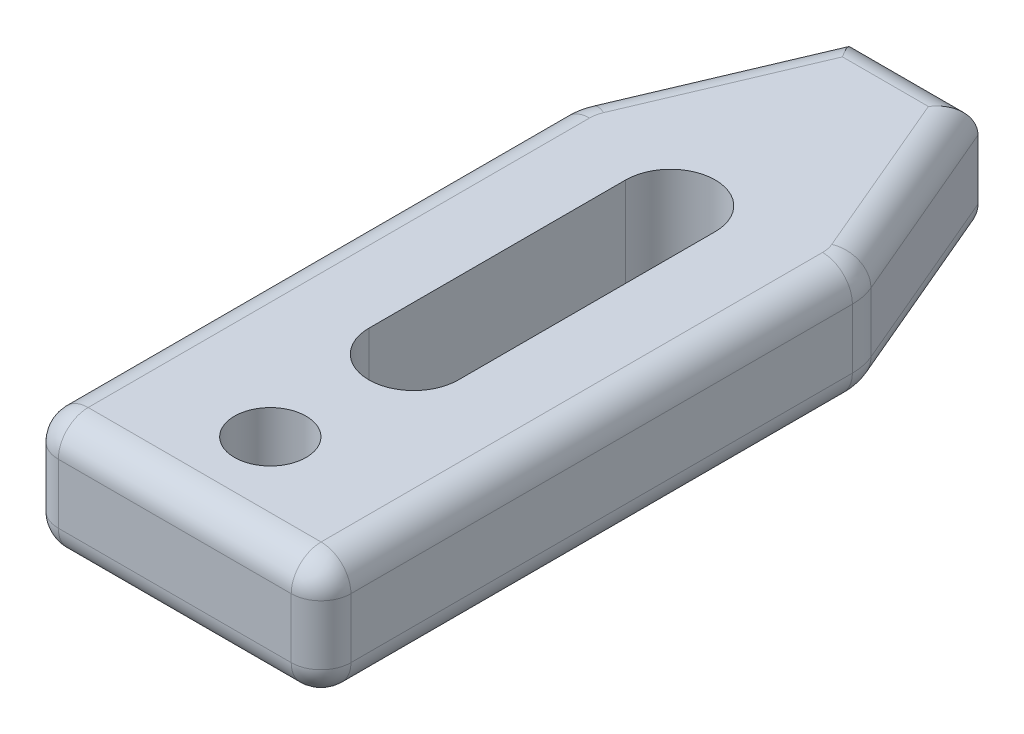
ISO-10303-21;
HEADER;
FILE_DESCRIPTION(('STEP AP214'),'2;1');
FILE_NAME('part.step','',(''),(''),'','','');
FILE_SCHEMA(('AUTOMOTIVE_DESIGN { 1 0 10303 214 1 1 1 1 }'));
ENDSEC;
DATA;
#1=APPLICATION_CONTEXT('core data for automotive mechanical design processes');
#2=APPLICATION_PROTOCOL_DEFINITION('international standard','automotive_design',2000,#1);
#3=PRODUCT_CONTEXT('',#1,'mechanical');
#4=PRODUCT('Part','Part','',(#3));
#5=PRODUCT_RELATED_PRODUCT_CATEGORY('part','',(#4));
#6=PRODUCT_DEFINITION_FORMATION('','',#4);
#7=PRODUCT_DEFINITION_CONTEXT('part definition',#1,'design');
#8=PRODUCT_DEFINITION('design','',#6,#7);
#9=PRODUCT_DEFINITION_SHAPE('','',#8);
#10=(LENGTH_UNIT() NAMED_UNIT(*) SI_UNIT(.MILLI.,.METRE.));
#11=(NAMED_UNIT(*) PLANE_ANGLE_UNIT() SI_UNIT($,.RADIAN.));
#12=(NAMED_UNIT(*) SI_UNIT($,.STERADIAN.) SOLID_ANGLE_UNIT());
#13=UNCERTAINTY_MEASURE_WITH_UNIT(LENGTH_MEASURE(1.E-05),#10,'distance_accuracy_value','');
#14=(GEOMETRIC_REPRESENTATION_CONTEXT(3) GLOBAL_UNCERTAINTY_ASSIGNED_CONTEXT((#13)) GLOBAL_UNIT_ASSIGNED_CONTEXT((#10,
#11,#12)) REPRESENTATION_CONTEXT('',''));
#15=CARTESIAN_POINT('',(0.,0.,0.));
#16=DIRECTION('',(0.,0.,1.));
#17=DIRECTION('',(1.,0.,0.));
#18=AXIS2_PLACEMENT_3D('',#15,#16,#17);
#19=CARTESIAN_POINT('',(0.,20.,0.));
#20=DIRECTION('',(0.,-1.,0.));
#21=DIRECTION('',(0.,0.,-1.));
#22=AXIS2_PLACEMENT_3D('',#19,#20,#21);
#23=PLANE('',#22);
#24=DIRECTION('',(0.,0.,1.));
#25=VECTOR('',#24,1.);
#26=CARTESIAN_POINT('',(-19.5,20.,0.));
#27=LINE('',#26,#25);
#28=CARTESIAN_POINT('',(-19.5,20.,-72.9665023872359));
#29=VERTEX_POINT('',#28);
#30=CARTESIAN_POINT('',(-19.5,20.,11.));
#31=VERTEX_POINT('',#30);
#32=EDGE_CURVE('E288',#29,#31,#27,.T.);
#33=ORIENTED_EDGE('',*,*,#32,.T.);
#34=DIRECTION('',(1.,0.,0.));
#35=VECTOR('',#34,1.);
#36=CARTESIAN_POINT('',(0.,20.,11.));
#37=LINE('',#36,#35);
#38=CARTESIAN_POINT('',(19.5,20.,11.));
#39=VERTEX_POINT('',#38);
#40=EDGE_CURVE('E371',#31,#39,#37,.T.);
#41=ORIENTED_EDGE('',*,*,#40,.T.);
#42=DIRECTION('',(0.,0.,-1.));
#43=VECTOR('',#42,1.);
#44=CARTESIAN_POINT('',(19.5,20.,0.));
#45=LINE('',#44,#43);
#46=CARTESIAN_POINT('',(19.5,20.,-72.9665023872358));
#47=VERTEX_POINT('',#46);
#48=EDGE_CURVE('E301',#39,#47,#45,.T.);
#49=ORIENTED_EDGE('',*,*,#48,.T.);
#50=CARTESIAN_POINT('',(14.5,20.,-72.9665023872358));
#51=DIRECTION('',(0.,-1.,0.));
#52=DIRECTION('',(0.,0.,-1.));
#53=AXIS2_PLACEMENT_3D('',#50,#51,#52);
#54=CIRCLE('',#53,5.);
#55=CARTESIAN_POINT('',(19.1029089093763,20.,-74.9192516215167));
#56=VERTEX_POINT('',#55);
#57=EDGE_CURVE('E299',#47,#56,#54,.F.);
#58=ORIENTED_EDGE('',*,*,#57,.T.);
#59=DIRECTION('',(0.39054984685617,0.,0.920581781875257));
#60=VECTOR('',#59,1.);
#61=CARTESIAN_POINT('',(5.89709109062372,20.,-106.047250765719));
#62=LINE('',#61,#60);
#63=CARTESIAN_POINT('',(7.189864142747,20.,-103.));
#64=VERTEX_POINT('',#63);
#65=EDGE_CURVE('E297',#56,#64,#62,.F.);
#66=ORIENTED_EDGE('',*,*,#65,.T.);
#67=DIRECTION('',(1.,0.,0.));
#68=VECTOR('',#67,1.);
#69=CARTESIAN_POINT('',(-10.5,20.,-103.));
#70=LINE('',#69,#68);
#71=CARTESIAN_POINT('',(-7.18986414274702,20.,-103.));
#72=VERTEX_POINT('',#71);
#73=EDGE_CURVE('E295',#64,#72,#70,.F.);
#74=ORIENTED_EDGE('',*,*,#73,.T.);
#75=DIRECTION('',(-0.390549846856169,0.,0.920581781875257));
#76=VECTOR('',#75,1.);
#77=CARTESIAN_POINT('',(-43.125106654826,20.,-18.2954997929565));
#78=LINE('',#77,#76);
#79=CARTESIAN_POINT('',(-19.1029089093763,20.,-74.9192516215167));
#80=VERTEX_POINT('',#79);
#81=EDGE_CURVE('E293',#72,#80,#78,.T.);
#82=ORIENTED_EDGE('',*,*,#81,.T.);
#83=CARTESIAN_POINT('',(-14.5,20.,-72.9665023872359));
#84=DIRECTION('',(0.,-1.,0.));
#85=DIRECTION('',(0.,0.,-1.));
#86=AXIS2_PLACEMENT_3D('',#83,#84,#85);
#87=CIRCLE('',#86,5.);
#88=EDGE_CURVE('E291',#80,#29,#87,.F.);
#89=ORIENTED_EDGE('',*,*,#88,.T.);
#90=EDGE_LOOP('',(#33,#41,#49,#58,#66,#74,#82,#89));
#91=FACE_BOUND('',#90,.T.);
#92=CARTESIAN_POINT('',(0.,20.,0.));
#93=DIRECTION('',(0.,1.,0.));
#94=DIRECTION('',(0.,0.,1.));
#95=AXIS2_PLACEMENT_3D('',#92,#93,#94);
#96=CIRCLE('',#95,6.);
#97=CARTESIAN_POINT('',(0.,20.,6.));
#98=VERTEX_POINT('',#97);
#99=EDGE_CURVE('E239',#98,#98,#96,.T.);
#100=ORIENTED_EDGE('',*,*,#99,.F.);
#101=EDGE_LOOP('',(#100));
#102=FACE_BOUND('',#101,.T.);
#103=CARTESIAN_POINT('',(0.,20.,-24.));
#104=DIRECTION('',(0.,1.,0.));
#105=DIRECTION('',(0.,0.,1.));
#106=AXIS2_PLACEMENT_3D('',#103,#104,#105);
#107=CIRCLE('',#106,7.5);
#108=CARTESIAN_POINT('',(-7.5,20.,-24.));
#109=VERTEX_POINT('',#108);
#110=CARTESIAN_POINT('',(7.5,20.,-24.));
#111=VERTEX_POINT('',#110);
#112=EDGE_CURVE('E193',#109,#111,#107,.T.);
#113=ORIENTED_EDGE('',*,*,#112,.F.);
#114=DIRECTION('',(0.,0.,1.));
#115=VECTOR('',#114,1.);
#116=CARTESIAN_POINT('',(-7.5,20.,0.));
#117=LINE('',#116,#115);
#118=CARTESIAN_POINT('',(-7.50000000000001,20.,-67.));
#119=VERTEX_POINT('',#118);
#120=EDGE_CURVE('E206',#119,#109,#117,.T.);
#121=ORIENTED_EDGE('',*,*,#120,.F.);
#122=CARTESIAN_POINT('',(0.,20.,-67.));
#123=DIRECTION('',(0.,1.,0.));
#124=DIRECTION('',(0.,0.,1.));
#125=AXIS2_PLACEMENT_3D('',#122,#123,#124);
#126=CIRCLE('',#125,7.5);
#127=CARTESIAN_POINT('',(7.49999999999999,20.,-67.));
#128=VERTEX_POINT('',#127);
#129=EDGE_CURVE('E214',#128,#119,#126,.T.);
#130=ORIENTED_EDGE('',*,*,#129,.F.);
#131=DIRECTION('',(0.,0.,1.));
#132=VECTOR('',#131,1.);
#133=CARTESIAN_POINT('',(7.5,20.,0.));
#134=LINE('',#133,#132);
#135=EDGE_CURVE('E209',#128,#111,#134,.T.);
#136=ORIENTED_EDGE('',*,*,#135,.T.);
#137=EDGE_LOOP('',(#113,#121,#130,#136));
#138=FACE_BOUND('',#137,.T.);
#139=ADVANCED_FACE('F38',(#91,#102,#138),#23,.F.);
#140=CARTESIAN_POINT('',(0.,0.,0.));
#141=DIRECTION('',(0.,-1.,0.));
#142=DIRECTION('',(0.,0.,-1.));
#143=AXIS2_PLACEMENT_3D('',#140,#141,#142);
#144=PLANE('',#143);
#145=DIRECTION('',(0.,0.,-1.));
#146=VECTOR('',#145,1.);
#147=CARTESIAN_POINT('',(19.5,0.,16.));
#148=LINE('',#147,#146);
#149=CARTESIAN_POINT('',(19.5,0.,-72.9665023872358));
#150=VERTEX_POINT('',#149);
#151=CARTESIAN_POINT('',(19.5,0.,11.));
#152=VERTEX_POINT('',#151);
#153=EDGE_CURVE('E269',#150,#152,#148,.F.);
#154=ORIENTED_EDGE('',*,*,#153,.T.);
#155=DIRECTION('',(1.,0.,0.));
#156=VECTOR('',#155,1.);
#157=CARTESIAN_POINT('',(-19.5,0.,11.));
#158=LINE('',#157,#156);
#159=CARTESIAN_POINT('',(-19.5,0.,11.));
#160=VERTEX_POINT('',#159);
#161=EDGE_CURVE('E11',#152,#160,#158,.F.);
#162=ORIENTED_EDGE('',*,*,#161,.T.);
#163=DIRECTION('',(0.,0.,1.));
#164=VECTOR('',#163,1.);
#165=CARTESIAN_POINT('',(-19.5,0.,-72.9665023872359));
#166=LINE('',#165,#164);
#167=CARTESIAN_POINT('',(-19.5,0.,-72.9665023872359));
#168=VERTEX_POINT('',#167);
#169=EDGE_CURVE('E256',#160,#168,#166,.F.);
#170=ORIENTED_EDGE('',*,*,#169,.T.);
#171=CARTESIAN_POINT('',(-14.5,0.,-72.9665023872359));
#172=DIRECTION('',(0.,-1.,0.));
#173=DIRECTION('',(0.,0.,-1.));
#174=AXIS2_PLACEMENT_3D('',#171,#172,#173);
#175=CIRCLE('',#174,5.);
#176=CARTESIAN_POINT('',(-19.1029089093763,0.,-74.9192516215167));
#177=VERTEX_POINT('',#176);
#178=EDGE_CURVE('E258',#168,#177,#175,.T.);
#179=ORIENTED_EDGE('',*,*,#178,.T.);
#180=DIRECTION('',(-0.390549846856169,0.,0.920581781875257));
#181=VECTOR('',#180,1.);
#182=CARTESIAN_POINT('',(-5.89709109062373,0.,-106.047250765719));
#183=LINE('',#182,#181);
#184=CARTESIAN_POINT('',(-7.18986414274701,0.,-103.));
#185=VERTEX_POINT('',#184);
#186=EDGE_CURVE('E260',#177,#185,#183,.F.);
#187=ORIENTED_EDGE('',*,*,#186,.T.);
#188=DIRECTION('',(1.,0.,0.));
#189=VECTOR('',#188,1.);
#190=CARTESIAN_POINT('',(0.,0.,-103.));
#191=LINE('',#190,#189);
#192=CARTESIAN_POINT('',(7.189864142747,0.,-103.));
#193=VERTEX_POINT('',#192);
#194=EDGE_CURVE('E262',#185,#193,#191,.T.);
#195=ORIENTED_EDGE('',*,*,#194,.T.);
#196=DIRECTION('',(0.39054984685617,0.,0.920581781875257));
#197=VECTOR('',#196,1.);
#198=CARTESIAN_POINT('',(43.1251066548261,0.,-18.2954997929565));
#199=LINE('',#198,#197);
#200=CARTESIAN_POINT('',(19.1029089093763,0.,-74.9192516215167));
#201=VERTEX_POINT('',#200);
#202=EDGE_CURVE('E264',#193,#201,#199,.T.);
#203=ORIENTED_EDGE('',*,*,#202,.T.);
#204=CARTESIAN_POINT('',(14.5,0.,-72.9665023872358));
#205=DIRECTION('',(0.,-1.,0.));
#206=DIRECTION('',(0.,0.,-1.));
#207=AXIS2_PLACEMENT_3D('',#204,#205,#206);
#208=CIRCLE('',#207,5.);
#209=EDGE_CURVE('E267',#201,#150,#208,.T.);
#210=ORIENTED_EDGE('',*,*,#209,.T.);
#211=EDGE_LOOP('',(#154,#162,#170,#179,#187,#195,#203,#210));
#212=FACE_BOUND('',#211,.T.);
#213=CARTESIAN_POINT('',(0.,0.,0.));
#214=DIRECTION('',(0.,1.,0.));
#215=DIRECTION('',(0.,0.,1.));
#216=AXIS2_PLACEMENT_3D('',#213,#214,#215);
#217=CIRCLE('',#216,6.);
#218=CARTESIAN_POINT('',(0.,0.,6.));
#219=VERTEX_POINT('',#218);
#220=EDGE_CURVE('E234',#219,#219,#217,.T.);
#221=ORIENTED_EDGE('',*,*,#220,.T.);
#222=EDGE_LOOP('',(#221));
#223=FACE_BOUND('',#222,.T.);
#224=CARTESIAN_POINT('',(0.,0.,-24.));
#225=DIRECTION('',(0.,1.,0.));
#226=DIRECTION('',(0.,0.,1.));
#227=AXIS2_PLACEMENT_3D('',#224,#225,#226);
#228=CIRCLE('',#227,7.5);
#229=CARTESIAN_POINT('',(-7.5,0.,-24.));
#230=VERTEX_POINT('',#229);
#231=CARTESIAN_POINT('',(7.5,0.,-24.));
#232=VERTEX_POINT('',#231);
#233=EDGE_CURVE('E195',#230,#232,#228,.T.);
#234=ORIENTED_EDGE('',*,*,#233,.T.);
#235=DIRECTION('',(0.,0.,1.));
#236=VECTOR('',#235,1.);
#237=CARTESIAN_POINT('',(7.5,0.,0.));
#238=LINE('',#237,#236);
#239=CARTESIAN_POINT('',(7.49999999999999,0.,-67.));
#240=VERTEX_POINT('',#239);
#241=EDGE_CURVE('E211',#240,#232,#238,.T.);
#242=ORIENTED_EDGE('',*,*,#241,.F.);
#243=CARTESIAN_POINT('',(0.,0.,-67.));
#244=DIRECTION('',(0.,1.,0.));
#245=DIRECTION('',(0.,0.,1.));
#246=AXIS2_PLACEMENT_3D('',#243,#244,#245);
#247=CIRCLE('',#246,7.5);
#248=CARTESIAN_POINT('',(-7.50000000000001,0.,-67.));
#249=VERTEX_POINT('',#248);
#250=EDGE_CURVE('E224',#240,#249,#247,.T.);
#251=ORIENTED_EDGE('',*,*,#250,.T.);
#252=DIRECTION('',(0.,0.,1.));
#253=VECTOR('',#252,1.);
#254=CARTESIAN_POINT('',(-7.5,0.,0.));
#255=LINE('',#254,#253);
#256=EDGE_CURVE('E221',#249,#230,#255,.T.);
#257=ORIENTED_EDGE('',*,*,#256,.T.);
#258=EDGE_LOOP('',(#234,#242,#251,#257));
#259=FACE_BOUND('',#258,.T.);
#260=ADVANCED_FACE('F517',(#212,#223,#259),#144,.T.);
#261=CARTESIAN_POINT('',(-24.5,20.,16.));
#262=DIRECTION('',(1.,0.,0.));
#263=DIRECTION('',(0.,0.,-1.));
#264=AXIS2_PLACEMENT_3D('',#261,#262,#263);
#265=PLANE('',#264);
#266=DIRECTION('',(0.,-1.,0.));
#267=VECTOR('',#266,1.);
#268=CARTESIAN_POINT('',(-24.5,20.,-72.9665023872359));
#269=LINE('',#268,#267);
#270=CARTESIAN_POINT('',(-24.5,15.,-72.9665023872359));
#271=VERTEX_POINT('',#270);
#272=CARTESIAN_POINT('',(-24.5,5.,-72.9665023872359));
#273=VERTEX_POINT('',#272);
#274=EDGE_CURVE('E250',#271,#273,#269,.T.);
#275=ORIENTED_EDGE('',*,*,#274,.T.);
#276=DIRECTION('',(0.,0.,1.));
#277=VECTOR('',#276,1.);
#278=CARTESIAN_POINT('',(-24.5,5.,16.));
#279=LINE('',#278,#277);
#280=CARTESIAN_POINT('',(-24.5,5.,11.));
#281=VERTEX_POINT('',#280);
#282=EDGE_CURVE('E320',#273,#281,#279,.T.);
#283=ORIENTED_EDGE('',*,*,#282,.T.);
#284=DIRECTION('',(0.,-1.,0.));
#285=VECTOR('',#284,1.);
#286=CARTESIAN_POINT('',(-24.5,20.,11.));
#287=LINE('',#286,#285);
#288=CARTESIAN_POINT('',(-24.5,15.,11.));
#289=VERTEX_POINT('',#288);
#290=EDGE_CURVE('E315',#281,#289,#287,.F.);
#291=ORIENTED_EDGE('',*,*,#290,.T.);
#292=DIRECTION('',(0.,0.,1.));
#293=VECTOR('',#292,1.);
#294=CARTESIAN_POINT('',(-24.5,15.,16.));
#295=LINE('',#294,#293);
#296=EDGE_CURVE('E318',#289,#271,#295,.F.);
#297=ORIENTED_EDGE('',*,*,#296,.T.);
#298=EDGE_LOOP('',(#275,#283,#291,#297));
#299=FACE_BOUND('',#298,.T.);
#300=ADVANCED_FACE('F457',(#299),#265,.F.);
#301=CARTESIAN_POINT('',(-24.5,20.,16.));
#302=DIRECTION('',(0.,0.,-1.));
#303=DIRECTION('',(-1.,0.,0.));
#304=AXIS2_PLACEMENT_3D('',#301,#302,#303);
#305=PLANE('',#304);
#306=DIRECTION('',(0.,-1.,0.));
#307=VECTOR('',#306,1.);
#308=CARTESIAN_POINT('',(-19.5,20.,16.));
#309=LINE('',#308,#307);
#310=CARTESIAN_POINT('',(-19.5,15.,16.));
#311=VERTEX_POINT('',#310);
#312=CARTESIAN_POINT('',(-19.5,5.,16.));
#313=VERTEX_POINT('',#312);
#314=EDGE_CURVE('E323',#311,#313,#309,.T.);
#315=ORIENTED_EDGE('',*,*,#314,.T.);
#316=DIRECTION('',(1.,0.,0.));
#317=VECTOR('',#316,1.);
#318=CARTESIAN_POINT('',(19.5,5.,16.));
#319=LINE('',#318,#317);
#320=CARTESIAN_POINT('',(19.5,5.,16.));
#321=VERTEX_POINT('',#320);
#322=EDGE_CURVE('E47',#313,#321,#319,.T.);
#323=ORIENTED_EDGE('',*,*,#322,.T.);
#324=DIRECTION('',(0.,-1.,0.));
#325=VECTOR('',#324,1.);
#326=CARTESIAN_POINT('',(19.5,20.,16.));
#327=LINE('',#326,#325);
#328=CARTESIAN_POINT('',(19.5,15.,16.));
#329=VERTEX_POINT('',#328);
#330=EDGE_CURVE('E325',#321,#329,#327,.F.);
#331=ORIENTED_EDGE('',*,*,#330,.T.);
#332=DIRECTION('',(1.,0.,0.));
#333=VECTOR('',#332,1.);
#334=CARTESIAN_POINT('',(-24.5,15.,16.));
#335=LINE('',#334,#333);
#336=EDGE_CURVE('E373',#329,#311,#335,.F.);
#337=ORIENTED_EDGE('',*,*,#336,.T.);
#338=EDGE_LOOP('',(#315,#323,#331,#337));
#339=FACE_BOUND('',#338,.T.);
#340=ADVANCED_FACE('F468',(#339),#305,.F.);
#341=CARTESIAN_POINT('',(24.5,20.,16.));
#342=DIRECTION('',(-1.,0.,0.));
#343=DIRECTION('',(0.,0.,1.));
#344=AXIS2_PLACEMENT_3D('',#341,#342,#343);
#345=PLANE('',#344);
#346=DIRECTION('',(0.,-1.,0.));
#347=VECTOR('',#346,1.);
#348=CARTESIAN_POINT('',(24.5,20.,11.));
#349=LINE('',#348,#347);
#350=CARTESIAN_POINT('',(24.5,15.,11.));
#351=VERTEX_POINT('',#350);
#352=CARTESIAN_POINT('',(24.5,5.,11.));
#353=VERTEX_POINT('',#352);
#354=EDGE_CURVE('E307',#351,#353,#349,.T.);
#355=ORIENTED_EDGE('',*,*,#354,.T.);
#356=DIRECTION('',(0.,0.,-1.));
#357=VECTOR('',#356,1.);
#358=CARTESIAN_POINT('',(24.5,5.,-72.9665023872358));
#359=LINE('',#358,#357);
#360=CARTESIAN_POINT('',(24.5,5.,-72.9665023872358));
#361=VERTEX_POINT('',#360);
#362=EDGE_CURVE('E313',#353,#361,#359,.T.);
#363=ORIENTED_EDGE('',*,*,#362,.T.);
#364=DIRECTION('',(0.,-1.,0.));
#365=VECTOR('',#364,1.);
#366=CARTESIAN_POINT('',(24.5,20.,-72.9665023872358));
#367=LINE('',#366,#365);
#368=CARTESIAN_POINT('',(24.5,15.,-72.9665023872358));
#369=VERTEX_POINT('',#368);
#370=EDGE_CURVE('E247',#361,#369,#367,.F.);
#371=ORIENTED_EDGE('',*,*,#370,.T.);
#372=DIRECTION('',(0.,0.,-1.));
#373=VECTOR('',#372,1.);
#374=CARTESIAN_POINT('',(24.5,15.,16.));
#375=LINE('',#374,#373);
#376=EDGE_CURVE('E310',#369,#351,#375,.F.);
#377=ORIENTED_EDGE('',*,*,#376,.T.);
#378=EDGE_LOOP('',(#355,#363,#371,#377));
#379=FACE_BOUND('',#378,.T.);
#380=ADVANCED_FACE('F405',(#379),#345,.F.);
#381=CARTESIAN_POINT('',(0.,20.,0.));
#382=DIRECTION('',(0.,-1.,0.));
#383=DIRECTION('',(0.,0.,-1.));
#384=AXIS2_PLACEMENT_3D('',#381,#382,#383);
#385=CYLINDRICAL_SURFACE('',#384,6.);
#386=ORIENTED_EDGE('',*,*,#99,.T.);
#387=EDGE_LOOP('',(#386));
#388=FACE_BOUND('',#387,.T.);
#389=ORIENTED_EDGE('',*,*,#220,.F.);
#390=EDGE_LOOP('',(#389));
#391=FACE_BOUND('',#390,.T.);
#392=ADVANCED_FACE('F527',(#388,#391),#385,.F.);
#393=CARTESIAN_POINT('',(47.7280155642023,20.,-20.2482490272374));
#394=DIRECTION('',(0.920581781875257,0.,-0.39054984685617));
#395=DIRECTION('',(-0.39054984685617,0.,-0.920581781875257));
#396=AXIS2_PLACEMENT_3D('',#393,#394,#395);
#397=PLANE('',#396);
#398=DIRECTION('',(0.,-1.,0.));
#399=VECTOR('',#398,1.);
#400=CARTESIAN_POINT('',(23.7058178187526,0.,-76.8720008557975));
#401=LINE('',#400,#399);
#402=CARTESIAN_POINT('',(23.7058178187526,15.,-76.8720008557975));
#403=VERTEX_POINT('',#402);
#404=CARTESIAN_POINT('',(23.7058178187526,5.,-76.8720008557975));
#405=VERTEX_POINT('',#404);
#406=EDGE_CURVE('E242',#403,#405,#401,.T.);
#407=ORIENTED_EDGE('',*,*,#406,.T.);
#408=DIRECTION('',(0.39054984685617,0.,0.920581781875257));
#409=VECTOR('',#408,1.);
#410=CARTESIAN_POINT('',(47.7280155642023,5.,-20.2482490272374));
#411=LINE('',#410,#409);
#412=CARTESIAN_POINT('',(10.5,5.,-108.));
#413=VERTEX_POINT('',#412);
#414=EDGE_CURVE('E273',#405,#413,#411,.F.);
#415=ORIENTED_EDGE('',*,*,#414,.T.);
#416=DIRECTION('',(0.,-1.,0.));
#417=VECTOR('',#416,1.);
#418=CARTESIAN_POINT('',(10.5,20.,-108.));
#419=LINE('',#418,#417);
#420=CARTESIAN_POINT('',(10.5,15.,-108.));
#421=VERTEX_POINT('',#420);
#422=EDGE_CURVE('E231',#421,#413,#419,.T.);
#423=ORIENTED_EDGE('',*,*,#422,.F.);
#424=DIRECTION('',(0.39054984685617,0.,0.920581781875257));
#425=VECTOR('',#424,1.);
#426=CARTESIAN_POINT('',(23.7058178187526,15.,-76.8720008557975));
#427=LINE('',#426,#425);
#428=EDGE_CURVE('E271',#421,#403,#427,.T.);
#429=ORIENTED_EDGE('',*,*,#428,.T.);
#430=EDGE_LOOP('',(#407,#415,#423,#429));
#431=FACE_BOUND('',#430,.T.);
#432=ADVANCED_FACE('F421',(#431),#397,.T.);
#433=CARTESIAN_POINT('',(0.,20.,-108.));
#434=DIRECTION('',(0.,0.,-1.));
#435=DIRECTION('',(-1.,0.,0.));
#436=AXIS2_PLACEMENT_3D('',#433,#434,#435);
#437=PLANE('',#436);
#438=DIRECTION('',(0.,-1.,0.));
#439=VECTOR('',#438,1.);
#440=CARTESIAN_POINT('',(-10.5,20.,-108.));
#441=LINE('',#440,#439);
#442=CARTESIAN_POINT('',(-10.5,15.,-108.));
#443=VERTEX_POINT('',#442);
#444=CARTESIAN_POINT('',(-10.5,5.,-108.));
#445=VERTEX_POINT('',#444);
#446=EDGE_CURVE('E200',#443,#445,#441,.T.);
#447=ORIENTED_EDGE('',*,*,#446,.F.);
#448=DIRECTION('',(1.,0.,0.));
#449=VECTOR('',#448,1.);
#450=CARTESIAN_POINT('',(10.5,15.,-108.));
#451=LINE('',#450,#449);
#452=EDGE_CURVE('E305',#443,#421,#451,.T.);
#453=ORIENTED_EDGE('',*,*,#452,.T.);
#454=ORIENTED_EDGE('',*,*,#422,.T.);
#455=DIRECTION('',(1.,0.,0.));
#456=VECTOR('',#455,1.);
#457=CARTESIAN_POINT('',(0.,5.,-108.));
#458=LINE('',#457,#456);
#459=EDGE_CURVE('E303',#413,#445,#458,.F.);
#460=ORIENTED_EDGE('',*,*,#459,.T.);
#461=EDGE_LOOP('',(#447,#453,#454,#460));
#462=FACE_BOUND('',#461,.T.);
#463=ADVANCED_FACE('F435',(#462),#437,.T.);
#464=CARTESIAN_POINT('',(0.,20.,-24.));
#465=DIRECTION('',(0.,-1.,0.));
#466=DIRECTION('',(0.,0.,-1.));
#467=AXIS2_PLACEMENT_3D('',#464,#465,#466);
#468=CYLINDRICAL_SURFACE('',#467,7.5);
#469=ORIENTED_EDGE('',*,*,#233,.F.);
#470=DIRECTION('',(0.,-1.,0.));
#471=VECTOR('',#470,1.);
#472=CARTESIAN_POINT('',(-7.5,20.,-24.));
#473=LINE('',#472,#471);
#474=EDGE_CURVE('E190',#109,#230,#473,.T.);
#475=ORIENTED_EDGE('',*,*,#474,.F.);
#476=ORIENTED_EDGE('',*,*,#112,.T.);
#477=DIRECTION('',(0.,-1.,0.));
#478=VECTOR('',#477,1.);
#479=CARTESIAN_POINT('',(7.5,20.,-24.));
#480=LINE('',#479,#478);
#481=EDGE_CURVE('E219',#111,#232,#480,.T.);
#482=ORIENTED_EDGE('',*,*,#481,.T.);
#483=EDGE_LOOP('',(#469,#475,#476,#482));
#484=FACE_BOUND('',#483,.T.);
#485=ADVANCED_FACE('F192',(#484),#468,.F.);
#486=CARTESIAN_POINT('',(-7.5,20.,0.));
#487=DIRECTION('',(1.,0.,0.));
#488=DIRECTION('',(0.,0.,-1.));
#489=AXIS2_PLACEMENT_3D('',#486,#487,#488);
#490=PLANE('',#489);
#491=ORIENTED_EDGE('',*,*,#256,.F.);
#492=DIRECTION('',(0.,-1.,0.));
#493=VECTOR('',#492,1.);
#494=CARTESIAN_POINT('',(-7.50000000000001,20.,-67.));
#495=LINE('',#494,#493);
#496=EDGE_CURVE('E201',#119,#249,#495,.T.);
#497=ORIENTED_EDGE('',*,*,#496,.F.);
#498=ORIENTED_EDGE('',*,*,#120,.T.);
#499=ORIENTED_EDGE('',*,*,#474,.T.);
#500=EDGE_LOOP('',(#491,#497,#498,#499));
#501=FACE_BOUND('',#500,.T.);
#502=ADVANCED_FACE('F213',(#501),#490,.T.);
#503=CARTESIAN_POINT('',(0.,20.,-67.));
#504=DIRECTION('',(0.,-1.,0.));
#505=DIRECTION('',(0.,0.,-1.));
#506=AXIS2_PLACEMENT_3D('',#503,#504,#505);
#507=CYLINDRICAL_SURFACE('',#506,7.5);
#508=ORIENTED_EDGE('',*,*,#250,.F.);
#509=DIRECTION('',(0.,-1.,0.));
#510=VECTOR('',#509,1.);
#511=CARTESIAN_POINT('',(7.49999999999999,20.,-67.));
#512=LINE('',#511,#510);
#513=EDGE_CURVE('E236',#128,#240,#512,.T.);
#514=ORIENTED_EDGE('',*,*,#513,.F.);
#515=ORIENTED_EDGE('',*,*,#129,.T.);
#516=ORIENTED_EDGE('',*,*,#496,.T.);
#517=EDGE_LOOP('',(#508,#514,#515,#516));
#518=FACE_BOUND('',#517,.T.);
#519=ADVANCED_FACE('F789',(#518),#507,.F.);
#520=CARTESIAN_POINT('',(7.5,20.,0.));
#521=DIRECTION('',(1.,0.,0.));
#522=DIRECTION('',(0.,0.,-1.));
#523=AXIS2_PLACEMENT_3D('',#520,#521,#522);
#524=PLANE('',#523);
#525=ORIENTED_EDGE('',*,*,#241,.T.);
#526=ORIENTED_EDGE('',*,*,#481,.F.);
#527=ORIENTED_EDGE('',*,*,#135,.F.);
#528=ORIENTED_EDGE('',*,*,#513,.T.);
#529=EDGE_LOOP('',(#525,#526,#527,#528));
#530=FACE_BOUND('',#529,.T.);
#531=ADVANCED_FACE('F763',(#530),#524,.F.);
#532=CARTESIAN_POINT('',(-47.7280155642023,20.,-20.2482490272373));
#533=DIRECTION('',(0.920581781875257,0.,0.390549846856169));
#534=DIRECTION('',(0.390549846856169,0.,-0.920581781875257));
#535=AXIS2_PLACEMENT_3D('',#532,#533,#534);
#536=PLANE('',#535);
#537=ORIENTED_EDGE('',*,*,#446,.T.);
#538=DIRECTION('',(-0.390549846856169,0.,0.920581781875257));
#539=VECTOR('',#538,1.);
#540=CARTESIAN_POINT('',(-23.7058178187526,5.,-76.8720008557975));
#541=LINE('',#540,#539);
#542=CARTESIAN_POINT('',(-23.7058178187526,5.,-76.8720008557976));
#543=VERTEX_POINT('',#542);
#544=EDGE_CURVE('E282',#445,#543,#541,.T.);
#545=ORIENTED_EDGE('',*,*,#544,.T.);
#546=DIRECTION('',(0.,-1.,0.));
#547=VECTOR('',#546,1.);
#548=CARTESIAN_POINT('',(-23.7058178187526,20.,-76.8720008557976));
#549=LINE('',#548,#547);
#550=CARTESIAN_POINT('',(-23.7058178187526,15.,-76.8720008557976));
#551=VERTEX_POINT('',#550);
#552=EDGE_CURVE('E253',#543,#551,#549,.F.);
#553=ORIENTED_EDGE('',*,*,#552,.T.);
#554=DIRECTION('',(-0.390549846856169,0.,0.920581781875257));
#555=VECTOR('',#554,1.);
#556=CARTESIAN_POINT('',(-47.7280155642023,15.,-20.2482490272373));
#557=LINE('',#556,#555);
#558=EDGE_CURVE('E280',#551,#443,#557,.F.);
#559=ORIENTED_EDGE('',*,*,#558,.T.);
#560=EDGE_LOOP('',(#537,#545,#553,#559));
#561=FACE_BOUND('',#560,.T.);
#562=ADVANCED_FACE('F439',(#561),#536,.F.);
#563=CARTESIAN_POINT('',(14.5,20.,-72.9665023872358));
#564=DIRECTION('',(0.,1.,0.));
#565=DIRECTION('',(0.,0.,1.));
#566=AXIS2_PLACEMENT_3D('',#563,#564,#565);
#567=CYLINDRICAL_SURFACE('',#566,10.);
#568=ORIENTED_EDGE('',*,*,#370,.F.);
#569=CARTESIAN_POINT('',(14.5,5.,-72.9665023872358));
#570=DIRECTION('',(0.,-1.,0.));
#571=DIRECTION('',(0.,0.,-1.));
#572=AXIS2_PLACEMENT_3D('',#569,#570,#571);
#573=CIRCLE('',#572,10.);
#574=EDGE_CURVE('E278',#361,#405,#573,.F.);
#575=ORIENTED_EDGE('',*,*,#574,.T.);
#576=ORIENTED_EDGE('',*,*,#406,.F.);
#577=CARTESIAN_POINT('',(14.5,15.,-72.9665023872358));
#578=DIRECTION('',(0.,-1.,0.));
#579=DIRECTION('',(0.,0.,-1.));
#580=AXIS2_PLACEMENT_3D('',#577,#578,#579);
#581=CIRCLE('',#580,10.);
#582=EDGE_CURVE('E276',#403,#369,#581,.T.);
#583=ORIENTED_EDGE('',*,*,#582,.T.);
#584=EDGE_LOOP('',(#568,#575,#576,#583));
#585=FACE_BOUND('',#584,.T.);
#586=ADVANCED_FACE('F417',(#585),#567,.T.);
#587=CARTESIAN_POINT('',(-14.5,20.,-72.9665023872359));
#588=DIRECTION('',(0.,-1.,0.));
#589=DIRECTION('',(0.,0.,-1.));
#590=AXIS2_PLACEMENT_3D('',#587,#588,#589);
#591=CYLINDRICAL_SURFACE('',#590,10.);
#592=ORIENTED_EDGE('',*,*,#552,.F.);
#593=CARTESIAN_POINT('',(-14.5,5.,-72.9665023872359));
#594=DIRECTION('',(0.,-1.,0.));
#595=DIRECTION('',(0.,0.,-1.));
#596=AXIS2_PLACEMENT_3D('',#593,#594,#595);
#597=CIRCLE('',#596,10.);
#598=EDGE_CURVE('E286',#543,#273,#597,.F.);
#599=ORIENTED_EDGE('',*,*,#598,.T.);
#600=ORIENTED_EDGE('',*,*,#274,.F.);
#601=CARTESIAN_POINT('',(-14.5,15.,-72.9665023872359));
#602=DIRECTION('',(0.,-1.,0.));
#603=DIRECTION('',(0.,0.,-1.));
#604=AXIS2_PLACEMENT_3D('',#601,#602,#603);
#605=CIRCLE('',#604,10.);
#606=EDGE_CURVE('E284',#271,#551,#605,.T.);
#607=ORIENTED_EDGE('',*,*,#606,.T.);
#608=EDGE_LOOP('',(#592,#599,#600,#607));
#609=FACE_BOUND('',#608,.T.);
#610=ADVANCED_FACE('F453',(#609),#591,.T.);
#611=CARTESIAN_POINT('',(-43.125106654826,15.,-18.2954997929565));
#612=DIRECTION('',(-0.390549846856169,0.,0.920581781875257));
#613=DIRECTION('',(0.920581781875257,0.,0.390549846856169));
#614=AXIS2_PLACEMENT_3D('',#611,#612,#613);
#615=CYLINDRICAL_SURFACE('',#614,5.);
#616=CARTESIAN_POINT('',(-7.18986414274702,15.,-103.));
#617=DIRECTION('',(-0.833831471838335,0.,0.552019090767625));
#618=DIRECTION('',(-0.552019090767625,0.,-0.833831471838335));
#619=AXIS2_PLACEMENT_3D('',#616,#617,#618);
#620=ELLIPSE('',#619,5.99641554542979,5.);
#621=EDGE_CURVE('E357',#443,#72,#620,.F.);
#622=ORIENTED_EDGE('',*,*,#621,.F.);
#623=ORIENTED_EDGE('',*,*,#558,.F.);
#624=CARTESIAN_POINT('',(-19.1029089093763,15.,-74.9192516215167));
#625=DIRECTION('',(-0.39054984685617,0.,0.920581781875257));
#626=DIRECTION('',(0.920581781875257,0.,0.39054984685617));
#627=AXIS2_PLACEMENT_3D('',#624,#625,#626);
#628=CIRCLE('',#627,5.);
#629=EDGE_CURVE('E222',#80,#551,#628,.T.);
#630=ORIENTED_EDGE('',*,*,#629,.F.);
#631=ORIENTED_EDGE('',*,*,#81,.F.);
#632=EDGE_LOOP('',(#622,#623,#630,#631));
#633=FACE_BOUND('',#632,.T.);
#634=ADVANCED_FACE('F486',(#633),#615,.T.);
#635=CARTESIAN_POINT('',(-14.5,15.,-72.9665023872359));
#636=DIRECTION('',(0.,-1.,0.));
#637=DIRECTION('',(0.,0.,-1.));
#638=AXIS2_PLACEMENT_3D('',#635,#636,#637);
#639=DEGENERATE_TOROIDAL_SURFACE('',#638,5.,5.,.T.);
#640=ORIENTED_EDGE('',*,*,#629,.T.);
#641=ORIENTED_EDGE('',*,*,#606,.F.);
#642=CARTESIAN_POINT('',(-19.5,15.,-72.9665023872359));
#643=DIRECTION('',(0.,0.,1.));
#644=DIRECTION('',(1.,0.,0.));
#645=AXIS2_PLACEMENT_3D('',#642,#643,#644);
#646=CIRCLE('',#645,5.);
#647=EDGE_CURVE('E354',#29,#271,#646,.T.);
#648=ORIENTED_EDGE('',*,*,#647,.F.);
#649=ORIENTED_EDGE('',*,*,#88,.F.);
#650=EDGE_LOOP('',(#640,#641,#648,#649));
#651=FACE_BOUND('',#650,.T.);
#652=ADVANCED_FACE('F483',(#651),#639,.T.);
#653=CARTESIAN_POINT('',(0.,15.,-103.));
#654=DIRECTION('',(-1.,0.,0.));
#655=DIRECTION('',(0.,0.,1.));
#656=AXIS2_PLACEMENT_3D('',#653,#654,#655);
#657=CYLINDRICAL_SURFACE('',#656,5.);
#658=ORIENTED_EDGE('',*,*,#621,.T.);
#659=ORIENTED_EDGE('',*,*,#73,.F.);
#660=CARTESIAN_POINT('',(7.18986414274699,15.,-103.));
#661=DIRECTION('',(-0.833831471838335,0.,-0.552019090767625));
#662=DIRECTION('',(-0.552019090767625,0.,0.833831471838335));
#663=AXIS2_PLACEMENT_3D('',#660,#661,#662);
#664=ELLIPSE('',#663,5.99641554542979,5.);
#665=EDGE_CURVE('E351',#421,#64,#664,.F.);
#666=ORIENTED_EDGE('',*,*,#665,.F.);
#667=ORIENTED_EDGE('',*,*,#452,.F.);
#668=EDGE_LOOP('',(#658,#659,#666,#667));
#669=FACE_BOUND('',#668,.T.);
#670=ADVANCED_FACE('F492',(#669),#657,.T.);
#671=CARTESIAN_POINT('',(-19.5,15.,0.));
#672=DIRECTION('',(0.,0.,1.));
#673=DIRECTION('',(1.,0.,0.));
#674=AXIS2_PLACEMENT_3D('',#671,#672,#673);
#675=CYLINDRICAL_SURFACE('',#674,5.);
#676=ORIENTED_EDGE('',*,*,#296,.F.);
#677=CARTESIAN_POINT('',(-19.5,15.,11.));
#678=DIRECTION('',(0.,0.,1.));
#679=DIRECTION('',(1.,0.,0.));
#680=AXIS2_PLACEMENT_3D('',#677,#678,#679);
#681=CIRCLE('',#680,5.);
#682=EDGE_CURVE('E364',#289,#31,#681,.F.);
#683=ORIENTED_EDGE('',*,*,#682,.T.);
#684=ORIENTED_EDGE('',*,*,#32,.F.);
#685=ORIENTED_EDGE('',*,*,#647,.T.);
#686=EDGE_LOOP('',(#676,#683,#684,#685));
#687=FACE_BOUND('',#686,.T.);
#688=ADVANCED_FACE('F478',(#687),#675,.T.);
#689=CARTESIAN_POINT('',(43.125106654826,15.,-18.2954997929565));
#690=DIRECTION('',(-0.39054984685617,0.,-0.920581781875257));
#691=DIRECTION('',(-0.920581781875257,0.,0.39054984685617));
#692=AXIS2_PLACEMENT_3D('',#689,#690,#691);
#693=CYLINDRICAL_SURFACE('',#692,5.);
#694=ORIENTED_EDGE('',*,*,#665,.T.);
#695=ORIENTED_EDGE('',*,*,#65,.F.);
#696=CARTESIAN_POINT('',(19.1029089093763,15.,-74.9192516215167));
#697=DIRECTION('',(0.39054984685617,0.,0.920581781875257));
#698=DIRECTION('',(0.920581781875257,0.,-0.39054984685617));
#699=AXIS2_PLACEMENT_3D('',#696,#697,#698);
#700=CIRCLE('',#699,5.);
#701=EDGE_CURVE('E348',#403,#56,#700,.T.);
#702=ORIENTED_EDGE('',*,*,#701,.F.);
#703=ORIENTED_EDGE('',*,*,#428,.F.);
#704=EDGE_LOOP('',(#694,#695,#702,#703));
#705=FACE_BOUND('',#704,.T.);
#706=ADVANCED_FACE('F495',(#705),#693,.T.);
#707=CARTESIAN_POINT('',(-19.5,20.,11.));
#708=DIRECTION('',(0.,-1.,0.));
#709=DIRECTION('',(0.,0.,-1.));
#710=AXIS2_PLACEMENT_3D('',#707,#708,#709);
#711=CYLINDRICAL_SURFACE('',#710,5.);
#712=ORIENTED_EDGE('',*,*,#290,.F.);
#713=CARTESIAN_POINT('',(-19.5,5.,11.));
#714=DIRECTION('',(0.,-1.,0.));
#715=DIRECTION('',(0.,0.,-1.));
#716=AXIS2_PLACEMENT_3D('',#713,#714,#715);
#717=CIRCLE('',#716,5.);
#718=EDGE_CURVE('E383',#281,#313,#717,.F.);
#719=ORIENTED_EDGE('',*,*,#718,.T.);
#720=ORIENTED_EDGE('',*,*,#314,.F.);
#721=CARTESIAN_POINT('',(-19.5,15.,11.));
#722=DIRECTION('',(0.,-1.,0.));
#723=DIRECTION('',(0.,0.,-1.));
#724=AXIS2_PLACEMENT_3D('',#721,#722,#723);
#725=CIRCLE('',#724,5.);
#726=EDGE_CURVE('E327',#311,#289,#725,.T.);
#727=ORIENTED_EDGE('',*,*,#726,.T.);
#728=EDGE_LOOP('',(#712,#719,#720,#727));
#729=FACE_BOUND('',#728,.T.);
#730=ADVANCED_FACE('F466',(#729),#711,.T.);
#731=CARTESIAN_POINT('',(14.5,15.,-72.9665023872358));
#732=DIRECTION('',(0.,-1.,0.));
#733=DIRECTION('',(0.,0.,-1.));
#734=AXIS2_PLACEMENT_3D('',#731,#732,#733);
#735=DEGENERATE_TOROIDAL_SURFACE('',#734,5.,5.,.T.);
#736=ORIENTED_EDGE('',*,*,#701,.T.);
#737=ORIENTED_EDGE('',*,*,#57,.F.);
#738=CARTESIAN_POINT('',(19.5,15.,-72.9665023872358));
#739=DIRECTION('',(0.,0.,1.));
#740=DIRECTION('',(1.,0.,0.));
#741=AXIS2_PLACEMENT_3D('',#738,#739,#740);
#742=CIRCLE('',#741,5.);
#743=EDGE_CURVE('E345',#369,#47,#742,.T.);
#744=ORIENTED_EDGE('',*,*,#743,.F.);
#745=ORIENTED_EDGE('',*,*,#582,.F.);
#746=EDGE_LOOP('',(#736,#737,#744,#745));
#747=FACE_BOUND('',#746,.T.);
#748=ADVANCED_FACE('F500',(#747),#735,.T.);
#749=CARTESIAN_POINT('',(-19.5,5.,16.));
#750=DIRECTION('',(0.,0.,-1.));
#751=DIRECTION('',(-1.,0.,0.));
#752=AXIS2_PLACEMENT_3D('',#749,#750,#751);
#753=CYLINDRICAL_SURFACE('',#752,5.);
#754=ORIENTED_EDGE('',*,*,#169,.F.);
#755=CARTESIAN_POINT('',(-19.5,5.,11.));
#756=DIRECTION('',(0.,0.,-1.));
#757=DIRECTION('',(-1.,0.,0.));
#758=AXIS2_PLACEMENT_3D('',#755,#756,#757);
#759=CIRCLE('',#758,5.);
#760=EDGE_CURVE('E375',#160,#281,#759,.T.);
#761=ORIENTED_EDGE('',*,*,#760,.T.);
#762=ORIENTED_EDGE('',*,*,#282,.F.);
#763=CARTESIAN_POINT('',(-19.5,5.,-72.9665023872359));
#764=DIRECTION('',(0.,0.,-1.));
#765=DIRECTION('',(-1.,0.,0.));
#766=AXIS2_PLACEMENT_3D('',#763,#764,#765);
#767=CIRCLE('',#766,5.);
#768=EDGE_CURVE('E342',#168,#273,#767,.T.);
#769=ORIENTED_EDGE('',*,*,#768,.F.);
#770=EDGE_LOOP('',(#754,#761,#762,#769));
#771=FACE_BOUND('',#770,.T.);
#772=ADVANCED_FACE('F462',(#771),#753,.T.);
#773=CARTESIAN_POINT('',(19.5,15.,0.));
#774=DIRECTION('',(0.,0.,-1.));
#775=DIRECTION('',(-1.,0.,0.));
#776=AXIS2_PLACEMENT_3D('',#773,#774,#775);
#777=CYLINDRICAL_SURFACE('',#776,5.);
#778=ORIENTED_EDGE('',*,*,#48,.F.);
#779=CARTESIAN_POINT('',(19.5,15.,11.));
#780=DIRECTION('',(0.,0.,-1.));
#781=DIRECTION('',(-1.,0.,0.));
#782=AXIS2_PLACEMENT_3D('',#779,#780,#781);
#783=CIRCLE('',#782,5.);
#784=EDGE_CURVE('E369',#39,#351,#783,.T.);
#785=ORIENTED_EDGE('',*,*,#784,.T.);
#786=ORIENTED_EDGE('',*,*,#376,.F.);
#787=ORIENTED_EDGE('',*,*,#743,.T.);
#788=EDGE_LOOP('',(#778,#785,#786,#787));
#789=FACE_BOUND('',#788,.T.);
#790=ADVANCED_FACE('F503',(#789),#777,.T.);
#791=CARTESIAN_POINT('',(-14.5,5.,-72.9665023872359));
#792=DIRECTION('',(0.,-1.,0.));
#793=DIRECTION('',(0.,0.,-1.));
#794=AXIS2_PLACEMENT_3D('',#791,#792,#793);
#795=DEGENERATE_TOROIDAL_SURFACE('',#794,5.,5.,.T.);
#796=ORIENTED_EDGE('',*,*,#768,.T.);
#797=ORIENTED_EDGE('',*,*,#598,.F.);
#798=CARTESIAN_POINT('',(-19.1029089093763,5.,-74.9192516215167));
#799=DIRECTION('',(0.39054984685617,0.,-0.920581781875256));
#800=DIRECTION('',(-0.920581781875257,0.,-0.39054984685617));
#801=AXIS2_PLACEMENT_3D('',#798,#799,#800);
#802=CIRCLE('',#801,5.);
#803=EDGE_CURVE('E339',#177,#543,#802,.T.);
#804=ORIENTED_EDGE('',*,*,#803,.F.);
#805=ORIENTED_EDGE('',*,*,#178,.F.);
#806=EDGE_LOOP('',(#796,#797,#804,#805));
#807=FACE_BOUND('',#806,.T.);
#808=ADVANCED_FACE('F449',(#807),#795,.T.);
#809=CARTESIAN_POINT('',(19.5,20.,11.));
#810=DIRECTION('',(0.,-1.,0.));
#811=DIRECTION('',(0.,0.,-1.));
#812=AXIS2_PLACEMENT_3D('',#809,#810,#811);
#813=CYLINDRICAL_SURFACE('',#812,5.);
#814=ORIENTED_EDGE('',*,*,#330,.F.);
#815=CARTESIAN_POINT('',(19.5,5.,11.));
#816=DIRECTION('',(0.,-1.,0.));
#817=DIRECTION('',(0.,0.,-1.));
#818=AXIS2_PLACEMENT_3D('',#815,#816,#817);
#819=CIRCLE('',#818,5.);
#820=EDGE_CURVE('E386',#321,#353,#819,.F.);
#821=ORIENTED_EDGE('',*,*,#820,.T.);
#822=ORIENTED_EDGE('',*,*,#354,.F.);
#823=CARTESIAN_POINT('',(19.5,15.,11.));
#824=DIRECTION('',(0.,-1.,0.));
#825=DIRECTION('',(0.,0.,-1.));
#826=AXIS2_PLACEMENT_3D('',#823,#824,#825);
#827=CIRCLE('',#826,5.);
#828=EDGE_CURVE('E366',#351,#329,#827,.T.);
#829=ORIENTED_EDGE('',*,*,#828,.T.);
#830=EDGE_LOOP('',(#814,#821,#822,#829));
#831=FACE_BOUND('',#830,.T.);
#832=ADVANCED_FACE('F402',(#831),#813,.T.);
#833=CARTESIAN_POINT('',(-43.125106654826,5.,-18.2954997929565));
#834=DIRECTION('',(0.390549846856169,0.,-0.920581781875257));
#835=DIRECTION('',(-0.920581781875257,0.,-0.390549846856169));
#836=AXIS2_PLACEMENT_3D('',#833,#834,#835);
#837=CYLINDRICAL_SURFACE('',#836,5.);
#838=ORIENTED_EDGE('',*,*,#803,.T.);
#839=ORIENTED_EDGE('',*,*,#544,.F.);
#840=CARTESIAN_POINT('',(-7.18986414274702,5.,-103.));
#841=DIRECTION('',(0.833831471838335,0.,-0.552019090767625));
#842=DIRECTION('',(0.552019090767625,0.,0.833831471838335));
#843=AXIS2_PLACEMENT_3D('',#840,#841,#842);
#844=ELLIPSE('',#843,5.99641554542979,5.);
#845=EDGE_CURVE('E336',#185,#445,#844,.T.);
#846=ORIENTED_EDGE('',*,*,#845,.F.);
#847=ORIENTED_EDGE('',*,*,#186,.F.);
#848=EDGE_LOOP('',(#838,#839,#846,#847));
#849=FACE_BOUND('',#848,.T.);
#850=ADVANCED_FACE('F443',(#849),#837,.T.);
#851=CARTESIAN_POINT('',(19.5,5.,16.));
#852=DIRECTION('',(0.,0.,1.));
#853=DIRECTION('',(1.,0.,0.));
#854=AXIS2_PLACEMENT_3D('',#851,#852,#853);
#855=CYLINDRICAL_SURFACE('',#854,5.);
#856=ORIENTED_EDGE('',*,*,#362,.F.);
#857=CARTESIAN_POINT('',(19.5,5.,11.));
#858=DIRECTION('',(0.,0.,1.));
#859=DIRECTION('',(1.,0.,0.));
#860=AXIS2_PLACEMENT_3D('',#857,#858,#859);
#861=CIRCLE('',#860,5.);
#862=EDGE_CURVE('E62',#353,#152,#861,.F.);
#863=ORIENTED_EDGE('',*,*,#862,.T.);
#864=ORIENTED_EDGE('',*,*,#153,.F.);
#865=CARTESIAN_POINT('',(19.5,5.,-72.9665023872358));
#866=DIRECTION('',(0.,0.,-1.));
#867=DIRECTION('',(-1.,0.,0.));
#868=AXIS2_PLACEMENT_3D('',#865,#866,#867);
#869=CIRCLE('',#868,5.);
#870=EDGE_CURVE('E333',#361,#150,#869,.T.);
#871=ORIENTED_EDGE('',*,*,#870,.F.);
#872=EDGE_LOOP('',(#856,#863,#864,#871));
#873=FACE_BOUND('',#872,.T.);
#874=ADVANCED_FACE('F409',(#873),#855,.T.);
#875=CARTESIAN_POINT('',(0.,5.,-103.));
#876=DIRECTION('',(1.,0.,0.));
#877=DIRECTION('',(0.,0.,-1.));
#878=AXIS2_PLACEMENT_3D('',#875,#876,#877);
#879=CYLINDRICAL_SURFACE('',#878,5.);
#880=ORIENTED_EDGE('',*,*,#845,.T.);
#881=ORIENTED_EDGE('',*,*,#459,.F.);
#882=CARTESIAN_POINT('',(7.189864142747,5.,-103.));
#883=DIRECTION('',(0.833831471838335,0.,0.552019090767625));
#884=DIRECTION('',(0.552019090767625,0.,-0.833831471838335));
#885=AXIS2_PLACEMENT_3D('',#882,#883,#884);
#886=ELLIPSE('',#885,5.99641554542979,5.);
#887=EDGE_CURVE('E330',#193,#413,#886,.T.);
#888=ORIENTED_EDGE('',*,*,#887,.F.);
#889=ORIENTED_EDGE('',*,*,#194,.F.);
#890=EDGE_LOOP('',(#880,#881,#888,#889));
#891=FACE_BOUND('',#890,.T.);
#892=ADVANCED_FACE('F431',(#891),#879,.T.);
#893=CARTESIAN_POINT('',(14.5,5.,-72.9665023872358));
#894=DIRECTION('',(0.,-1.,0.));
#895=DIRECTION('',(0.,0.,-1.));
#896=AXIS2_PLACEMENT_3D('',#893,#894,#895);
#897=DEGENERATE_TOROIDAL_SURFACE('',#896,5.,5.,.T.);
#898=ORIENTED_EDGE('',*,*,#870,.T.);
#899=ORIENTED_EDGE('',*,*,#209,.F.);
#900=CARTESIAN_POINT('',(19.1029089093763,5.,-74.9192516215167));
#901=DIRECTION('',(-0.39054984685617,0.,-0.920581781875256));
#902=DIRECTION('',(-0.920581781875257,0.,0.39054984685617));
#903=AXIS2_PLACEMENT_3D('',#900,#901,#902);
#904=CIRCLE('',#903,5.);
#905=EDGE_CURVE('E328',#405,#201,#904,.T.);
#906=ORIENTED_EDGE('',*,*,#905,.F.);
#907=ORIENTED_EDGE('',*,*,#574,.F.);
#908=EDGE_LOOP('',(#898,#899,#906,#907));
#909=FACE_BOUND('',#908,.T.);
#910=ADVANCED_FACE('F414',(#909),#897,.T.);
#911=CARTESIAN_POINT('',(43.1251066548261,5.,-18.2954997929565));
#912=DIRECTION('',(0.39054984685617,0.,0.920581781875257));
#913=DIRECTION('',(0.920581781875257,0.,-0.39054984685617));
#914=AXIS2_PLACEMENT_3D('',#911,#912,#913);
#915=CYLINDRICAL_SURFACE('',#914,5.);
#916=ORIENTED_EDGE('',*,*,#887,.T.);
#917=ORIENTED_EDGE('',*,*,#414,.F.);
#918=ORIENTED_EDGE('',*,*,#905,.T.);
#919=ORIENTED_EDGE('',*,*,#202,.F.);
#920=EDGE_LOOP('',(#916,#917,#918,#919));
#921=FACE_BOUND('',#920,.T.);
#922=ADVANCED_FACE('F425',(#921),#915,.T.);
#923=CARTESIAN_POINT('',(19.5,15.,11.));
#924=DIRECTION('',(0.,0.,1.));
#925=DIRECTION('',(1.,0.,0.));
#926=AXIS2_PLACEMENT_3D('',#923,#924,#925);
#927=SPHERICAL_SURFACE('',#926,5.);
#928=ORIENTED_EDGE('',*,*,#828,.F.);
#929=ORIENTED_EDGE('',*,*,#784,.F.);
#930=CARTESIAN_POINT('',(19.5,15.,11.));
#931=DIRECTION('',(-1.,0.,0.));
#932=DIRECTION('',(0.,0.,1.));
#933=AXIS2_PLACEMENT_3D('',#930,#931,#932);
#934=CIRCLE('',#933,5.);
#935=EDGE_CURVE('E331',#329,#39,#934,.T.);
#936=ORIENTED_EDGE('',*,*,#935,.F.);
#937=EDGE_LOOP('',(#928,#929,#936));
#938=FACE_BOUND('',#937,.T.);
#939=ADVANCED_FACE('F506',(#938),#927,.T.);
#940=CARTESIAN_POINT('',(0.,15.,11.));
#941=DIRECTION('',(1.,0.,0.));
#942=DIRECTION('',(0.,0.,-1.));
#943=AXIS2_PLACEMENT_3D('',#940,#941,#942);
#944=CYLINDRICAL_SURFACE('',#943,5.);
#945=ORIENTED_EDGE('',*,*,#935,.T.);
#946=ORIENTED_EDGE('',*,*,#40,.F.);
#947=CARTESIAN_POINT('',(-19.5,15.,11.));
#948=DIRECTION('',(-1.,0.,0.));
#949=DIRECTION('',(0.,0.,1.));
#950=AXIS2_PLACEMENT_3D('',#947,#948,#949);
#951=CIRCLE('',#950,5.);
#952=EDGE_CURVE('E376',#311,#31,#951,.T.);
#953=ORIENTED_EDGE('',*,*,#952,.F.);
#954=ORIENTED_EDGE('',*,*,#336,.F.);
#955=EDGE_LOOP('',(#945,#946,#953,#954));
#956=FACE_BOUND('',#955,.T.);
#957=ADVANCED_FACE('F471',(#956),#944,.T.);
#958=CARTESIAN_POINT('',(-19.5,15.,11.));
#959=DIRECTION('',(0.,0.,1.));
#960=DIRECTION('',(1.,0.,0.));
#961=AXIS2_PLACEMENT_3D('',#958,#959,#960);
#962=SPHERICAL_SURFACE('',#961,5.);
#963=ORIENTED_EDGE('',*,*,#952,.T.);
#964=ORIENTED_EDGE('',*,*,#682,.F.);
#965=ORIENTED_EDGE('',*,*,#726,.F.);
#966=EDGE_LOOP('',(#963,#964,#965));
#967=FACE_BOUND('',#966,.T.);
#968=ADVANCED_FACE('F476',(#967),#962,.T.);
#969=CARTESIAN_POINT('',(19.5,5.,11.));
#970=DIRECTION('',(0.,0.,1.));
#971=DIRECTION('',(1.,0.,0.));
#972=AXIS2_PLACEMENT_3D('',#969,#970,#971);
#973=SPHERICAL_SURFACE('',#972,5.);
#974=ORIENTED_EDGE('',*,*,#862,.F.);
#975=ORIENTED_EDGE('',*,*,#820,.F.);
#976=CARTESIAN_POINT('',(19.5,5.,11.));
#977=DIRECTION('',(-1.,0.,0.));
#978=DIRECTION('',(0.,0.,1.));
#979=AXIS2_PLACEMENT_3D('',#976,#977,#978);
#980=CIRCLE('',#979,5.);
#981=EDGE_CURVE('E42',#152,#321,#980,.T.);
#982=ORIENTED_EDGE('',*,*,#981,.F.);
#983=EDGE_LOOP('',(#974,#975,#982));
#984=FACE_BOUND('',#983,.T.);
#985=ADVANCED_FACE('F40',(#984),#973,.T.);
#986=CARTESIAN_POINT('',(-24.5,5.,11.));
#987=DIRECTION('',(-1.,0.,0.));
#988=DIRECTION('',(0.,0.,1.));
#989=AXIS2_PLACEMENT_3D('',#986,#987,#988);
#990=CYLINDRICAL_SURFACE('',#989,5.);
#991=ORIENTED_EDGE('',*,*,#981,.T.);
#992=ORIENTED_EDGE('',*,*,#322,.F.);
#993=CARTESIAN_POINT('',(-19.5,5.,11.));
#994=DIRECTION('',(-1.,0.,0.));
#995=DIRECTION('',(0.,0.,1.));
#996=AXIS2_PLACEMENT_3D('',#993,#994,#995);
#997=CIRCLE('',#996,5.);
#998=EDGE_CURVE('E388',#160,#313,#997,.T.);
#999=ORIENTED_EDGE('',*,*,#998,.F.);
#1000=ORIENTED_EDGE('',*,*,#161,.F.);
#1001=EDGE_LOOP('',(#991,#992,#999,#1000));
#1002=FACE_BOUND('',#1001,.T.);
#1003=ADVANCED_FACE('F397',(#1002),#990,.T.);
#1004=CARTESIAN_POINT('',(-19.5,5.,11.));
#1005=DIRECTION('',(0.,0.,1.));
#1006=DIRECTION('',(1.,0.,0.));
#1007=AXIS2_PLACEMENT_3D('',#1004,#1005,#1006);
#1008=SPHERICAL_SURFACE('',#1007,5.);
#1009=ORIENTED_EDGE('',*,*,#998,.T.);
#1010=ORIENTED_EDGE('',*,*,#718,.F.);
#1011=ORIENTED_EDGE('',*,*,#760,.F.);
#1012=EDGE_LOOP('',(#1009,#1010,#1011));
#1013=FACE_BOUND('',#1012,.T.);
#1014=ADVANCED_FACE('F463',(#1013),#1008,.T.);
#1015=CLOSED_SHELL('',(#139,#260,#300,#340,#380,#392,#432,#463,#485,#502,#519,#531,#562,#586,
#610,#634,#652,#670,#688,#706,#730,#748,#772,#790,#808,#832,#850,#874,#892,#910,#922,#939,#957,
#968,#985,#1003,#1014));
#1016=MANIFOLD_SOLID_BREP('B2',#1015);
#1017=ADVANCED_BREP_SHAPE_REPRESENTATION('',(#18,#1016),#14);
#1018=SHAPE_DEFINITION_REPRESENTATION(#9,#1017);
ENDSEC;
END-ISO-10303-21;
